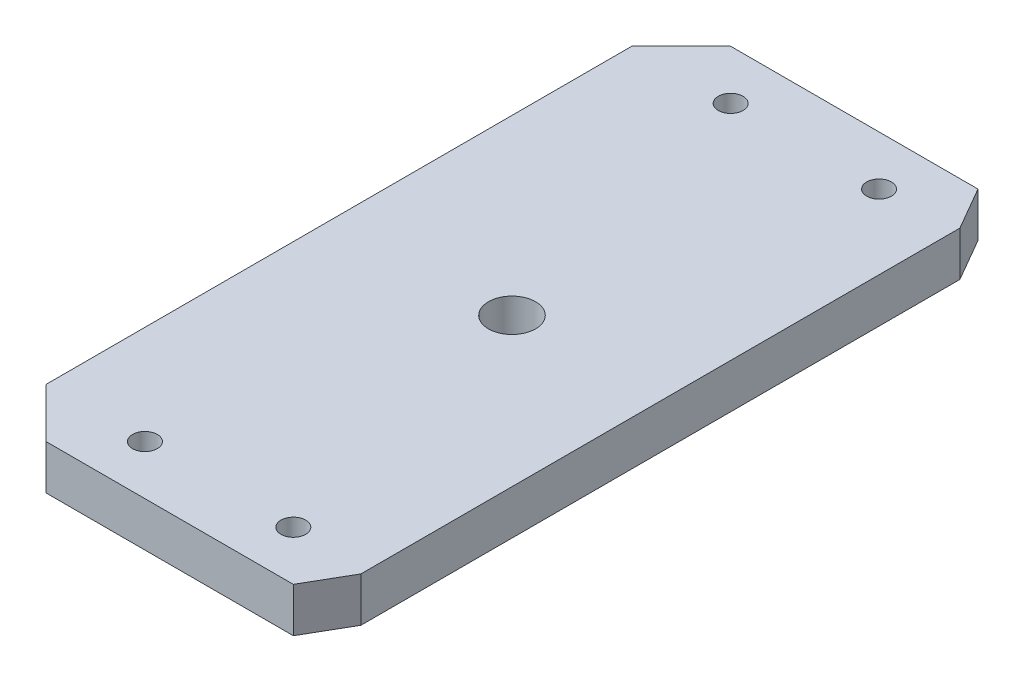
ISO-10303-21;
HEADER;
FILE_DESCRIPTION(('STEP AP214'),'2;1');
FILE_NAME('part.step','',(''),(''),'','','');
FILE_SCHEMA(('AUTOMOTIVE_DESIGN { 1 0 10303 214 1 1 1 1 }'));
ENDSEC;
DATA;
#1=APPLICATION_CONTEXT('core data for automotive mechanical design processes');
#2=APPLICATION_PROTOCOL_DEFINITION('international standard','automotive_design',2000,#1);
#3=PRODUCT_CONTEXT('',#1,'mechanical');
#4=PRODUCT('Part','Part','',(#3));
#5=PRODUCT_RELATED_PRODUCT_CATEGORY('part','',(#4));
#6=PRODUCT_DEFINITION_FORMATION('','',#4);
#7=PRODUCT_DEFINITION_CONTEXT('part definition',#1,'design');
#8=PRODUCT_DEFINITION('design','',#6,#7);
#9=PRODUCT_DEFINITION_SHAPE('','',#8);
#10=(LENGTH_UNIT() NAMED_UNIT(*) SI_UNIT(.MILLI.,.METRE.));
#11=(NAMED_UNIT(*) PLANE_ANGLE_UNIT() SI_UNIT($,.RADIAN.));
#12=(NAMED_UNIT(*) SI_UNIT($,.STERADIAN.) SOLID_ANGLE_UNIT());
#13=UNCERTAINTY_MEASURE_WITH_UNIT(LENGTH_MEASURE(1.E-05),#10,'distance_accuracy_value','');
#14=(GEOMETRIC_REPRESENTATION_CONTEXT(3) GLOBAL_UNCERTAINTY_ASSIGNED_CONTEXT((#13)) GLOBAL_UNIT_ASSIGNED_CONTEXT((#10,
#11,#12)) REPRESENTATION_CONTEXT('',''));
#15=CARTESIAN_POINT('',(0.,0.,0.));
#16=DIRECTION('',(0.,0.,1.));
#17=DIRECTION('',(1.,0.,0.));
#18=AXIS2_PLACEMENT_3D('',#15,#16,#17);
#19=CARTESIAN_POINT('',(0.,9.,0.));
#20=DIRECTION('',(0.,1.,0.));
#21=DIRECTION('',(0.,0.,1.));
#22=AXIS2_PLACEMENT_3D('',#19,#20,#21);
#23=PLANE('',#22);
#24=CARTESIAN_POINT('',(-14.9999999999999,9.,-59.2));
#25=DIRECTION('',(0.,1.,0.));
#26=DIRECTION('',(0.,0.,-1.));
#27=AXIS2_PLACEMENT_3D('',#24,#25,#26);
#28=CIRCLE('',#27,2.5);
#29=CARTESIAN_POINT('',(-14.9999999999999,9.,-61.7));
#30=VERTEX_POINT('',#29);
#31=EDGE_CURVE('E139',#30,#30,#28,.T.);
#32=ORIENTED_EDGE('',*,*,#31,.F.);
#33=EDGE_LOOP('',(#32));
#34=FACE_BOUND('',#33,.T.);
#35=CARTESIAN_POINT('',(15.0000000000001,9.,-59.2));
#36=DIRECTION('',(0.,1.,0.));
#37=DIRECTION('',(0.,0.,1.));
#38=AXIS2_PLACEMENT_3D('',#35,#36,#37);
#39=CIRCLE('',#38,2.5);
#40=CARTESIAN_POINT('',(15.0000000000001,9.,-56.7));
#41=VERTEX_POINT('',#40);
#42=EDGE_CURVE('E133',#41,#41,#39,.T.);
#43=ORIENTED_EDGE('',*,*,#42,.F.);
#44=EDGE_LOOP('',(#43));
#45=FACE_BOUND('',#44,.T.);
#46=CARTESIAN_POINT('',(15.,9.,59.2));
#47=DIRECTION('',(0.,1.,0.));
#48=DIRECTION('',(0.,0.,-1.));
#49=AXIS2_PLACEMENT_3D('',#46,#47,#48);
#50=CIRCLE('',#49,2.5);
#51=CARTESIAN_POINT('',(15.,9.,56.7));
#52=VERTEX_POINT('',#51);
#53=EDGE_CURVE('E126',#52,#52,#50,.T.);
#54=ORIENTED_EDGE('',*,*,#53,.F.);
#55=EDGE_LOOP('',(#54));
#56=FACE_BOUND('',#55,.T.);
#57=CARTESIAN_POINT('',(-15.,9.,59.2));
#58=DIRECTION('',(0.,1.,0.));
#59=DIRECTION('',(0.,0.,1.));
#60=AXIS2_PLACEMENT_3D('',#57,#58,#59);
#61=CIRCLE('',#60,2.5);
#62=CARTESIAN_POINT('',(-15.,9.,61.7));
#63=VERTEX_POINT('',#62);
#64=EDGE_CURVE('E129',#63,#63,#61,.T.);
#65=ORIENTED_EDGE('',*,*,#64,.F.);
#66=EDGE_LOOP('',(#65));
#67=FACE_BOUND('',#66,.T.);
#68=DIRECTION('',(1.,0.,0.));
#69=VECTOR('',#68,1.);
#70=CARTESIAN_POINT('',(-25.,9.,69.2));
#71=LINE('',#70,#69);
#72=CARTESIAN_POINT('',(-25.,9.,69.2));
#73=VERTEX_POINT('',#72);
#74=CARTESIAN_POINT('',(25.,9.,69.2));
#75=VERTEX_POINT('',#74);
#76=EDGE_CURVE('E58',#73,#75,#71,.T.);
#77=ORIENTED_EDGE('',*,*,#76,.T.);
#78=DIRECTION('',(0.499999999999995,0.,-0.866025403784442));
#79=VECTOR('',#78,1.);
#80=CARTESIAN_POINT('',(25.,9.,69.2));
#81=LINE('',#80,#79);
#82=CARTESIAN_POINT('',(30.,9.,60.5397459621555));
#83=VERTEX_POINT('',#82);
#84=EDGE_CURVE('E111',#75,#83,#81,.T.);
#85=ORIENTED_EDGE('',*,*,#84,.T.);
#86=DIRECTION('',(0.,0.,-1.));
#87=VECTOR('',#86,1.);
#88=CARTESIAN_POINT('',(30.,9.,60.5397459621555));
#89=LINE('',#88,#87);
#90=CARTESIAN_POINT('',(30.,9.,-60.5397459621555));
#91=VERTEX_POINT('',#90);
#92=EDGE_CURVE('E188',#83,#91,#89,.T.);
#93=ORIENTED_EDGE('',*,*,#92,.T.);
#94=DIRECTION('',(-0.499999999999996,0.,-0.866025403784441));
#95=VECTOR('',#94,1.);
#96=CARTESIAN_POINT('',(25.,9.,-69.2));
#97=LINE('',#96,#95);
#98=CARTESIAN_POINT('',(25.,9.,-69.2));
#99=VERTEX_POINT('',#98);
#100=EDGE_CURVE('E94',#91,#99,#97,.T.);
#101=ORIENTED_EDGE('',*,*,#100,.T.);
#102=DIRECTION('',(-1.,0.,0.));
#103=VECTOR('',#102,1.);
#104=CARTESIAN_POINT('',(-25.,9.,-69.2));
#105=LINE('',#104,#103);
#106=CARTESIAN_POINT('',(-25.,9.,-69.2));
#107=VERTEX_POINT('',#106);
#108=EDGE_CURVE('E86',#99,#107,#105,.T.);
#109=ORIENTED_EDGE('',*,*,#108,.T.);
#110=DIRECTION('',(-0.707106781186543,0.,0.707106781186552));
#111=VECTOR('',#110,1.);
#112=CARTESIAN_POINT('',(-25.,9.,-69.2));
#113=LINE('',#112,#111);
#114=CARTESIAN_POINT('',(-35.,9.,-59.1999999999999));
#115=VERTEX_POINT('',#114);
#116=EDGE_CURVE('E91',#107,#115,#113,.T.);
#117=ORIENTED_EDGE('',*,*,#116,.T.);
#118=DIRECTION('',(0.,0.,1.));
#119=VECTOR('',#118,1.);
#120=CARTESIAN_POINT('',(-35.,9.,59.1999999999999));
#121=LINE('',#120,#119);
#122=CARTESIAN_POINT('',(-35.,9.,59.1999999999999));
#123=VERTEX_POINT('',#122);
#124=EDGE_CURVE('E107',#115,#123,#121,.T.);
#125=ORIENTED_EDGE('',*,*,#124,.T.);
#126=DIRECTION('',(0.707106781186544,0.,0.707106781186551));
#127=VECTOR('',#126,1.);
#128=CARTESIAN_POINT('',(-25.,9.,69.2));
#129=LINE('',#128,#127);
#130=EDGE_CURVE('E109',#123,#73,#129,.T.);
#131=ORIENTED_EDGE('',*,*,#130,.T.);
#132=EDGE_LOOP('',(#77,#85,#93,#101,#109,#117,#125,#131));
#133=FACE_BOUND('',#132,.T.);
#134=CARTESIAN_POINT('',(0.,9.,0.));
#135=DIRECTION('',(0.,1.,0.));
#136=DIRECTION('',(0.,0.,1.));
#137=AXIS2_PLACEMENT_3D('',#134,#135,#136);
#138=CIRCLE('',#137,4.7625);
#139=CARTESIAN_POINT('',(0.,9.,4.76250000000001));
#140=VERTEX_POINT('',#139);
#141=EDGE_CURVE('E150',#140,#140,#138,.T.);
#142=ORIENTED_EDGE('',*,*,#141,.F.);
#143=EDGE_LOOP('',(#142));
#144=FACE_BOUND('',#143,.T.);
#145=ADVANCED_FACE('F41',(#34,#45,#56,#67,#133,#144),#23,.T.);
#146=CARTESIAN_POINT('',(0.,0.,0.));
#147=DIRECTION('',(0.,1.,0.));
#148=DIRECTION('',(0.,0.,1.));
#149=AXIS2_PLACEMENT_3D('',#146,#147,#148);
#150=PLANE('',#149);
#151=CARTESIAN_POINT('',(-14.9999999999999,0.,-59.2));
#152=DIRECTION('',(0.,1.,0.));
#153=DIRECTION('',(0.,0.,-1.));
#154=AXIS2_PLACEMENT_3D('',#151,#152,#153);
#155=CIRCLE('',#154,2.5);
#156=CARTESIAN_POINT('',(-14.9999999999999,0.,-61.7));
#157=VERTEX_POINT('',#156);
#158=EDGE_CURVE('E125',#157,#157,#155,.T.);
#159=ORIENTED_EDGE('',*,*,#158,.T.);
#160=EDGE_LOOP('',(#159));
#161=FACE_BOUND('',#160,.T.);
#162=CARTESIAN_POINT('',(15.0000000000001,0.,-59.2));
#163=DIRECTION('',(0.,1.,0.));
#164=DIRECTION('',(0.,0.,1.));
#165=AXIS2_PLACEMENT_3D('',#162,#163,#164);
#166=CIRCLE('',#165,2.5);
#167=CARTESIAN_POINT('',(15.0000000000001,0.,-56.7));
#168=VERTEX_POINT('',#167);
#169=EDGE_CURVE('E136',#168,#168,#166,.T.);
#170=ORIENTED_EDGE('',*,*,#169,.T.);
#171=EDGE_LOOP('',(#170));
#172=FACE_BOUND('',#171,.T.);
#173=CARTESIAN_POINT('',(15.,0.,59.2));
#174=DIRECTION('',(0.,1.,0.));
#175=DIRECTION('',(0.,0.,-1.));
#176=AXIS2_PLACEMENT_3D('',#173,#174,#175);
#177=CIRCLE('',#176,2.5);
#178=CARTESIAN_POINT('',(15.,0.,56.7));
#179=VERTEX_POINT('',#178);
#180=EDGE_CURVE('E130',#179,#179,#177,.T.);
#181=ORIENTED_EDGE('',*,*,#180,.T.);
#182=EDGE_LOOP('',(#181));
#183=FACE_BOUND('',#182,.T.);
#184=CARTESIAN_POINT('',(-15.,0.,59.2));
#185=DIRECTION('',(0.,1.,0.));
#186=DIRECTION('',(0.,0.,1.));
#187=AXIS2_PLACEMENT_3D('',#184,#185,#186);
#188=CIRCLE('',#187,2.5);
#189=CARTESIAN_POINT('',(-15.,0.,61.7));
#190=VERTEX_POINT('',#189);
#191=EDGE_CURVE('E144',#190,#190,#188,.T.);
#192=ORIENTED_EDGE('',*,*,#191,.T.);
#193=EDGE_LOOP('',(#192));
#194=FACE_BOUND('',#193,.T.);
#195=DIRECTION('',(-1.,0.,0.));
#196=VECTOR('',#195,1.);
#197=CARTESIAN_POINT('',(-25.,0.,-69.2));
#198=LINE('',#197,#196);
#199=CARTESIAN_POINT('',(25.,0.,-69.2));
#200=VERTEX_POINT('',#199);
#201=CARTESIAN_POINT('',(-25.,0.,-69.2));
#202=VERTEX_POINT('',#201);
#203=EDGE_CURVE('E70',#200,#202,#198,.T.);
#204=ORIENTED_EDGE('',*,*,#203,.F.);
#205=DIRECTION('',(0.499999999999996,0.,0.866025403784441));
#206=VECTOR('',#205,1.);
#207=CARTESIAN_POINT('',(25.,0.,-69.2));
#208=LINE('',#207,#206);
#209=CARTESIAN_POINT('',(30.,0.,-60.5397459621555));
#210=VERTEX_POINT('',#209);
#211=EDGE_CURVE('E185',#200,#210,#208,.T.);
#212=ORIENTED_EDGE('',*,*,#211,.T.);
#213=DIRECTION('',(0.,0.,1.));
#214=VECTOR('',#213,1.);
#215=CARTESIAN_POINT('',(30.,0.,60.5397459621555));
#216=LINE('',#215,#214);
#217=CARTESIAN_POINT('',(30.,0.,60.5397459621555));
#218=VERTEX_POINT('',#217);
#219=EDGE_CURVE('E183',#210,#218,#216,.T.);
#220=ORIENTED_EDGE('',*,*,#219,.T.);
#221=DIRECTION('',(-0.499999999999995,0.,0.866025403784442));
#222=VECTOR('',#221,1.);
#223=CARTESIAN_POINT('',(25.,0.,69.2));
#224=LINE('',#223,#222);
#225=CARTESIAN_POINT('',(25.,0.,69.2));
#226=VERTEX_POINT('',#225);
#227=EDGE_CURVE('E177',#218,#226,#224,.T.);
#228=ORIENTED_EDGE('',*,*,#227,.T.);
#229=DIRECTION('',(1.,0.,0.));
#230=VECTOR('',#229,1.);
#231=CARTESIAN_POINT('',(-25.,0.,69.2));
#232=LINE('',#231,#230);
#233=CARTESIAN_POINT('',(-25.,0.,69.2));
#234=VERTEX_POINT('',#233);
#235=EDGE_CURVE('E96',#234,#226,#232,.T.);
#236=ORIENTED_EDGE('',*,*,#235,.F.);
#237=DIRECTION('',(-0.707106781186544,0.,-0.707106781186551));
#238=VECTOR('',#237,1.);
#239=CARTESIAN_POINT('',(-25.,0.,69.2));
#240=LINE('',#239,#238);
#241=CARTESIAN_POINT('',(-35.,0.,59.1999999999999));
#242=VERTEX_POINT('',#241);
#243=EDGE_CURVE('E121',#234,#242,#240,.T.);
#244=ORIENTED_EDGE('',*,*,#243,.T.);
#245=DIRECTION('',(0.,0.,-1.));
#246=VECTOR('',#245,1.);
#247=CARTESIAN_POINT('',(-35.,0.,59.1999999999999));
#248=LINE('',#247,#246);
#249=CARTESIAN_POINT('',(-35.,0.,-59.1999999999999));
#250=VERTEX_POINT('',#249);
#251=EDGE_CURVE('E123',#242,#250,#248,.T.);
#252=ORIENTED_EDGE('',*,*,#251,.T.);
#253=DIRECTION('',(0.707106781186543,0.,-0.707106781186552));
#254=VECTOR('',#253,1.);
#255=CARTESIAN_POINT('',(-25.,0.,-69.2));
#256=LINE('',#255,#254);
#257=EDGE_CURVE('E114',#250,#202,#256,.T.);
#258=ORIENTED_EDGE('',*,*,#257,.T.);
#259=EDGE_LOOP('',(#204,#212,#220,#228,#236,#244,#252,#258));
#260=FACE_BOUND('',#259,.T.);
#261=CARTESIAN_POINT('',(0.,0.,0.));
#262=DIRECTION('',(0.,1.,0.));
#263=DIRECTION('',(0.,0.,1.));
#264=AXIS2_PLACEMENT_3D('',#261,#262,#263);
#265=CIRCLE('',#264,4.7625);
#266=CARTESIAN_POINT('',(0.,0.,4.76250000000001));
#267=VERTEX_POINT('',#266);
#268=EDGE_CURVE('E147',#267,#267,#265,.T.);
#269=ORIENTED_EDGE('',*,*,#268,.T.);
#270=EDGE_LOOP('',(#269));
#271=FACE_BOUND('',#270,.T.);
#272=ADVANCED_FACE('F172',(#161,#172,#183,#194,#260,#271),#150,.F.);
#273=CARTESIAN_POINT('',(-25.,9.,-69.2));
#274=DIRECTION('',(0.,0.,1.));
#275=DIRECTION('',(1.,0.,0.));
#276=AXIS2_PLACEMENT_3D('',#273,#274,#275);
#277=PLANE('',#276);
#278=ORIENTED_EDGE('',*,*,#203,.T.);
#279=DIRECTION('',(0.,-1.,0.));
#280=VECTOR('',#279,1.);
#281=CARTESIAN_POINT('',(-25.,9.,-69.2));
#282=LINE('',#281,#280);
#283=EDGE_CURVE('E50',#107,#202,#282,.T.);
#284=ORIENTED_EDGE('',*,*,#283,.F.);
#285=ORIENTED_EDGE('',*,*,#108,.F.);
#286=DIRECTION('',(0.,-1.,0.));
#287=VECTOR('',#286,1.);
#288=CARTESIAN_POINT('',(25.,9.,-69.2));
#289=LINE('',#288,#287);
#290=EDGE_CURVE('E11',#99,#200,#289,.T.);
#291=ORIENTED_EDGE('',*,*,#290,.T.);
#292=EDGE_LOOP('',(#278,#284,#285,#291));
#293=FACE_BOUND('',#292,.T.);
#294=ADVANCED_FACE('F43',(#293),#277,.F.);
#295=CARTESIAN_POINT('',(-25.,9.,69.2));
#296=DIRECTION('',(0.,0.,-1.));
#297=DIRECTION('',(-1.,0.,0.));
#298=AXIS2_PLACEMENT_3D('',#295,#296,#297);
#299=PLANE('',#298);
#300=ORIENTED_EDGE('',*,*,#235,.T.);
#301=DIRECTION('',(0.,-1.,0.));
#302=VECTOR('',#301,1.);
#303=CARTESIAN_POINT('',(25.,9.,69.2));
#304=LINE('',#303,#302);
#305=EDGE_CURVE('E156',#75,#226,#304,.T.);
#306=ORIENTED_EDGE('',*,*,#305,.F.);
#307=ORIENTED_EDGE('',*,*,#76,.F.);
#308=DIRECTION('',(0.,-1.,0.));
#309=VECTOR('',#308,1.);
#310=CARTESIAN_POINT('',(-25.,9.,69.2));
#311=LINE('',#310,#309);
#312=EDGE_CURVE('E101',#73,#234,#311,.T.);
#313=ORIENTED_EDGE('',*,*,#312,.T.);
#314=EDGE_LOOP('',(#300,#306,#307,#313));
#315=FACE_BOUND('',#314,.T.);
#316=ADVANCED_FACE('F165',(#315),#299,.F.);
#317=CARTESIAN_POINT('',(0.,9.,0.));
#318=DIRECTION('',(0.,-1.,0.));
#319=DIRECTION('',(0.,0.,-1.));
#320=AXIS2_PLACEMENT_3D('',#317,#318,#319);
#321=CYLINDRICAL_SURFACE('',#320,4.7625);
#322=ORIENTED_EDGE('',*,*,#141,.T.);
#323=EDGE_LOOP('',(#322));
#324=FACE_BOUND('',#323,.T.);
#325=ORIENTED_EDGE('',*,*,#268,.F.);
#326=EDGE_LOOP('',(#325));
#327=FACE_BOUND('',#326,.T.);
#328=ADVANCED_FACE('F241',(#324,#327),#321,.F.);
#329=CARTESIAN_POINT('',(-15.,0.,59.2));
#330=DIRECTION('',(0.,1.,0.));
#331=DIRECTION('',(0.,0.,1.));
#332=AXIS2_PLACEMENT_3D('',#329,#330,#331);
#333=CYLINDRICAL_SURFACE('',#332,2.5);
#334=ORIENTED_EDGE('',*,*,#191,.F.);
#335=EDGE_LOOP('',(#334));
#336=FACE_BOUND('',#335,.T.);
#337=ORIENTED_EDGE('',*,*,#64,.T.);
#338=EDGE_LOOP('',(#337));
#339=FACE_BOUND('',#338,.T.);
#340=ADVANCED_FACE('F249',(#336,#339),#333,.F.);
#341=CARTESIAN_POINT('',(15.,0.,59.2));
#342=DIRECTION('',(0.,1.,0.));
#343=DIRECTION('',(0.,0.,1.));
#344=AXIS2_PLACEMENT_3D('',#341,#342,#343);
#345=CYLINDRICAL_SURFACE('',#344,2.5);
#346=ORIENTED_EDGE('',*,*,#180,.F.);
#347=EDGE_LOOP('',(#346));
#348=FACE_BOUND('',#347,.T.);
#349=ORIENTED_EDGE('',*,*,#53,.T.);
#350=EDGE_LOOP('',(#349));
#351=FACE_BOUND('',#350,.T.);
#352=ADVANCED_FACE('F317',(#348,#351),#345,.F.);
#353=CARTESIAN_POINT('',(15.0000000000001,0.,-59.2));
#354=DIRECTION('',(0.,1.,0.));
#355=DIRECTION('',(0.,0.,1.));
#356=AXIS2_PLACEMENT_3D('',#353,#354,#355);
#357=CYLINDRICAL_SURFACE('',#356,2.5);
#358=ORIENTED_EDGE('',*,*,#169,.F.);
#359=EDGE_LOOP('',(#358));
#360=FACE_BOUND('',#359,.T.);
#361=ORIENTED_EDGE('',*,*,#42,.T.);
#362=EDGE_LOOP('',(#361));
#363=FACE_BOUND('',#362,.T.);
#364=ADVANCED_FACE('F307',(#360,#363),#357,.F.);
#365=CARTESIAN_POINT('',(-14.9999999999999,0.,-59.2));
#366=DIRECTION('',(0.,1.,0.));
#367=DIRECTION('',(0.,0.,1.));
#368=AXIS2_PLACEMENT_3D('',#365,#366,#367);
#369=CYLINDRICAL_SURFACE('',#368,2.5);
#370=ORIENTED_EDGE('',*,*,#158,.F.);
#371=EDGE_LOOP('',(#370));
#372=FACE_BOUND('',#371,.T.);
#373=ORIENTED_EDGE('',*,*,#31,.T.);
#374=EDGE_LOOP('',(#373));
#375=FACE_BOUND('',#374,.T.);
#376=ADVANCED_FACE('F269',(#372,#375),#369,.F.);
#377=CARTESIAN_POINT('',(-25.,-138.76080138137,-69.2));
#378=DIRECTION('',(-0.707106781186552,0.,-0.707106781186543));
#379=DIRECTION('',(-0.707106781186543,0.,0.707106781186552));
#380=AXIS2_PLACEMENT_3D('',#377,#378,#379);
#381=PLANE('',#380);
#382=ORIENTED_EDGE('',*,*,#257,.F.);
#383=DIRECTION('',(0.,1.,0.));
#384=VECTOR('',#383,1.);
#385=CARTESIAN_POINT('',(-35.,-138.76080138137,-59.1999999999999));
#386=LINE('',#385,#384);
#387=EDGE_CURVE('E105',#250,#115,#386,.T.);
#388=ORIENTED_EDGE('',*,*,#387,.T.);
#389=ORIENTED_EDGE('',*,*,#116,.F.);
#390=ORIENTED_EDGE('',*,*,#283,.T.);
#391=EDGE_LOOP('',(#382,#388,#389,#390));
#392=FACE_BOUND('',#391,.T.);
#393=ADVANCED_FACE('F103',(#392),#381,.T.);
#394=CARTESIAN_POINT('',(-25.,-138.76080138137,69.2));
#395=DIRECTION('',(-0.707106781186551,0.,0.707106781186544));
#396=DIRECTION('',(0.707106781186544,0.,0.707106781186551));
#397=AXIS2_PLACEMENT_3D('',#394,#395,#396);
#398=PLANE('',#397);
#399=ORIENTED_EDGE('',*,*,#243,.F.);
#400=ORIENTED_EDGE('',*,*,#312,.F.);
#401=ORIENTED_EDGE('',*,*,#130,.F.);
#402=DIRECTION('',(0.,1.,0.));
#403=VECTOR('',#402,1.);
#404=CARTESIAN_POINT('',(-35.,-138.76080138137,59.1999999999999));
#405=LINE('',#404,#403);
#406=EDGE_CURVE('E118',#242,#123,#405,.T.);
#407=ORIENTED_EDGE('',*,*,#406,.F.);
#408=EDGE_LOOP('',(#399,#400,#401,#407));
#409=FACE_BOUND('',#408,.T.);
#410=ADVANCED_FACE('F178',(#409),#398,.T.);
#411=CARTESIAN_POINT('',(-35.,-138.76080138137,59.1999999999999));
#412=DIRECTION('',(-1.,0.,0.));
#413=DIRECTION('',(0.,0.,1.));
#414=AXIS2_PLACEMENT_3D('',#411,#412,#413);
#415=PLANE('',#414);
#416=ORIENTED_EDGE('',*,*,#251,.F.);
#417=ORIENTED_EDGE('',*,*,#406,.T.);
#418=ORIENTED_EDGE('',*,*,#124,.F.);
#419=ORIENTED_EDGE('',*,*,#387,.F.);
#420=EDGE_LOOP('',(#416,#417,#418,#419));
#421=FACE_BOUND('',#420,.T.);
#422=ADVANCED_FACE('F219',(#421),#415,.T.);
#423=CARTESIAN_POINT('',(25.,-138.76080138137,-69.2));
#424=DIRECTION('',(0.866025403784441,0.,-0.499999999999996));
#425=DIRECTION('',(-0.499999999999996,0.,-0.866025403784441));
#426=AXIS2_PLACEMENT_3D('',#423,#424,#425);
#427=PLANE('',#426);
#428=ORIENTED_EDGE('',*,*,#211,.F.);
#429=ORIENTED_EDGE('',*,*,#290,.F.);
#430=ORIENTED_EDGE('',*,*,#100,.F.);
#431=DIRECTION('',(0.,1.,0.));
#432=VECTOR('',#431,1.);
#433=CARTESIAN_POINT('',(30.,-138.76080138137,-60.5397459621555));
#434=LINE('',#433,#432);
#435=EDGE_CURVE('E182',#210,#91,#434,.T.);
#436=ORIENTED_EDGE('',*,*,#435,.F.);
#437=EDGE_LOOP('',(#428,#429,#430,#436));
#438=FACE_BOUND('',#437,.T.);
#439=ADVANCED_FACE('F211',(#438),#427,.T.);
#440=CARTESIAN_POINT('',(30.,-138.76080138137,60.5397459621555));
#441=DIRECTION('',(1.,0.,0.));
#442=DIRECTION('',(0.,0.,-1.));
#443=AXIS2_PLACEMENT_3D('',#440,#441,#442);
#444=PLANE('',#443);
#445=ORIENTED_EDGE('',*,*,#219,.F.);
#446=ORIENTED_EDGE('',*,*,#435,.T.);
#447=ORIENTED_EDGE('',*,*,#92,.F.);
#448=DIRECTION('',(0.,1.,0.));
#449=VECTOR('',#448,1.);
#450=CARTESIAN_POINT('',(30.,-138.76080138137,60.5397459621555));
#451=LINE('',#450,#449);
#452=EDGE_CURVE('E190',#218,#83,#451,.T.);
#453=ORIENTED_EDGE('',*,*,#452,.F.);
#454=EDGE_LOOP('',(#445,#446,#447,#453));
#455=FACE_BOUND('',#454,.T.);
#456=ADVANCED_FACE('F205',(#455),#444,.T.);
#457=CARTESIAN_POINT('',(25.,-138.76080138137,69.2));
#458=DIRECTION('',(0.866025403784442,0.,0.499999999999995));
#459=DIRECTION('',(0.499999999999995,0.,-0.866025403784442));
#460=AXIS2_PLACEMENT_3D('',#457,#458,#459);
#461=PLANE('',#460);
#462=ORIENTED_EDGE('',*,*,#227,.F.);
#463=ORIENTED_EDGE('',*,*,#452,.T.);
#464=ORIENTED_EDGE('',*,*,#84,.F.);
#465=ORIENTED_EDGE('',*,*,#305,.T.);
#466=EDGE_LOOP('',(#462,#463,#464,#465));
#467=FACE_BOUND('',#466,.T.);
#468=ADVANCED_FACE('F198',(#467),#461,.T.);
#469=CLOSED_SHELL('',(#145,#272,#294,#316,#328,#340,#352,#364,#376,#393,#410,#422,#439,#456,#468));
#470=MANIFOLD_SOLID_BREP('B2',#469);
#471=ADVANCED_BREP_SHAPE_REPRESENTATION('',(#18,#470),#14);
#472=SHAPE_DEFINITION_REPRESENTATION(#9,#471);
ENDSEC;
END-ISO-10303-21;
